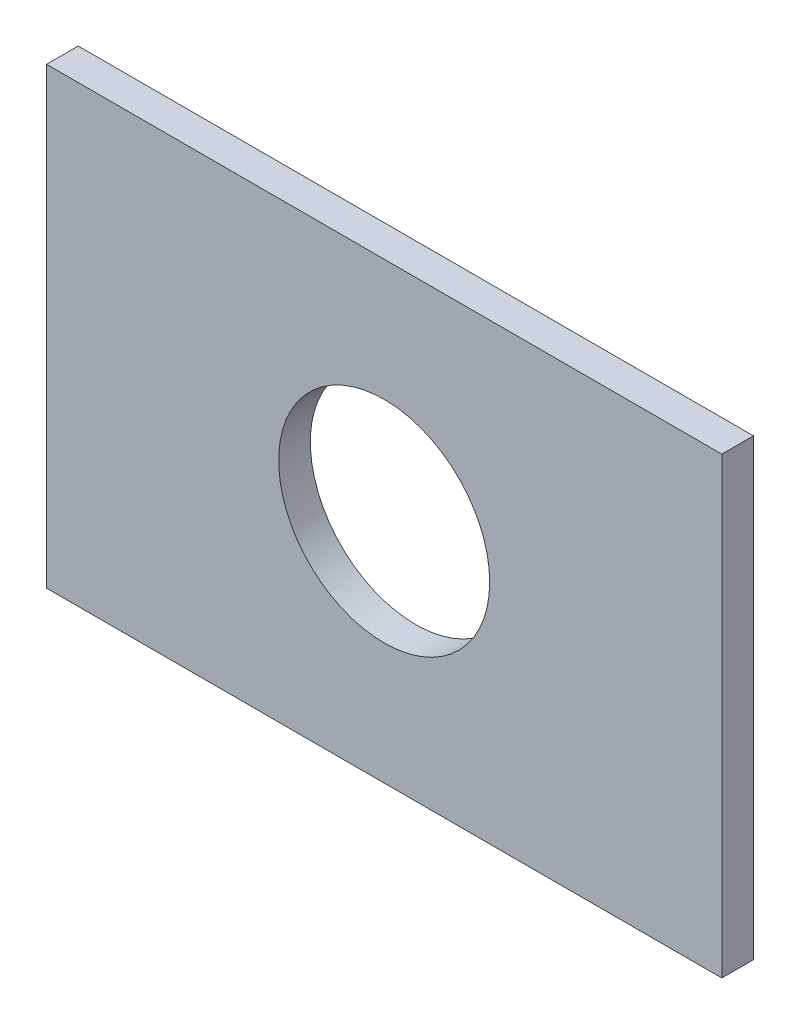
ISO-10303-21;
HEADER;
FILE_DESCRIPTION(('STEP AP214'),'2;1');
FILE_NAME('part.step','',(''),(''),'','','');
FILE_SCHEMA(('AUTOMOTIVE_DESIGN { 1 0 10303 214 1 1 1 1 }'));
ENDSEC;
DATA;
#1=APPLICATION_CONTEXT('core data for automotive mechanical design processes');
#2=APPLICATION_PROTOCOL_DEFINITION('international standard','automotive_design',2000,#1);
#3=PRODUCT_CONTEXT('',#1,'mechanical');
#4=PRODUCT('Part','Part','',(#3));
#5=PRODUCT_RELATED_PRODUCT_CATEGORY('part','',(#4));
#6=PRODUCT_DEFINITION_FORMATION('','',#4);
#7=PRODUCT_DEFINITION_CONTEXT('part definition',#1,'design');
#8=PRODUCT_DEFINITION('design','',#6,#7);
#9=PRODUCT_DEFINITION_SHAPE('','',#8);
#10=(LENGTH_UNIT() NAMED_UNIT(*) SI_UNIT(.MILLI.,.METRE.));
#11=(NAMED_UNIT(*) PLANE_ANGLE_UNIT() SI_UNIT($,.RADIAN.));
#12=(NAMED_UNIT(*) SI_UNIT($,.STERADIAN.) SOLID_ANGLE_UNIT());
#13=UNCERTAINTY_MEASURE_WITH_UNIT(LENGTH_MEASURE(1.E-05),#10,'distance_accuracy_value','');
#14=(GEOMETRIC_REPRESENTATION_CONTEXT(3) GLOBAL_UNCERTAINTY_ASSIGNED_CONTEXT((#13)) GLOBAL_UNIT_ASSIGNED_CONTEXT((#10,
#11,#12)) REPRESENTATION_CONTEXT('',''));
#15=CARTESIAN_POINT('',(0.,0.,0.));
#16=DIRECTION('',(0.,0.,1.));
#17=DIRECTION('',(1.,0.,0.));
#18=AXIS2_PLACEMENT_3D('',#15,#16,#17);
#19=CARTESIAN_POINT('',(-32.,21.5,3.));
#20=DIRECTION('',(0.,0.,-1.));
#21=DIRECTION('',(-1.,0.,0.));
#22=AXIS2_PLACEMENT_3D('',#19,#20,#21);
#23=PLANE('',#22);
#24=DIRECTION('',(0.,-1.,0.));
#25=VECTOR('',#24,1.);
#26=CARTESIAN_POINT('',(-32.,-21.5,3.));
#27=LINE('',#26,#25);
#28=CARTESIAN_POINT('',(-32.,21.5,3.));
#29=VERTEX_POINT('',#28);
#30=CARTESIAN_POINT('',(-32.,-21.5,3.));
#31=VERTEX_POINT('',#30);
#32=EDGE_CURVE('E101',#29,#31,#27,.T.);
#33=ORIENTED_EDGE('',*,*,#32,.T.);
#34=DIRECTION('',(1.,0.,0.));
#35=VECTOR('',#34,1.);
#36=CARTESIAN_POINT('',(-32.,-21.5,3.));
#37=LINE('',#36,#35);
#38=CARTESIAN_POINT('',(32.,-21.5,3.));
#39=VERTEX_POINT('',#38);
#40=EDGE_CURVE('E86',#31,#39,#37,.T.);
#41=ORIENTED_EDGE('',*,*,#40,.T.);
#42=DIRECTION('',(0.,1.,0.));
#43=VECTOR('',#42,1.);
#44=CARTESIAN_POINT('',(32.,-21.5,3.));
#45=LINE('',#44,#43);
#46=CARTESIAN_POINT('',(32.,21.5,3.));
#47=VERTEX_POINT('',#46);
#48=EDGE_CURVE('E52',#39,#47,#45,.T.);
#49=ORIENTED_EDGE('',*,*,#48,.T.);
#50=DIRECTION('',(-1.,0.,0.));
#51=VECTOR('',#50,1.);
#52=CARTESIAN_POINT('',(-32.,21.5,3.));
#53=LINE('',#52,#51);
#54=EDGE_CURVE('E47',#47,#29,#53,.T.);
#55=ORIENTED_EDGE('',*,*,#54,.T.);
#56=EDGE_LOOP('',(#33,#41,#49,#55));
#57=FACE_BOUND('',#56,.T.);
#58=CARTESIAN_POINT('',(0.,0.,3.));
#59=DIRECTION('',(0.,0.,1.));
#60=DIRECTION('',(1.,0.,0.));
#61=AXIS2_PLACEMENT_3D('',#58,#59,#60);
#62=CIRCLE('',#61,10.);
#63=CARTESIAN_POINT('',(10.,0.,3.));
#64=VERTEX_POINT('',#63);
#65=EDGE_CURVE('E91',#64,#64,#62,.T.);
#66=ORIENTED_EDGE('',*,*,#65,.F.);
#67=EDGE_LOOP('',(#66));
#68=FACE_BOUND('',#67,.T.);
#69=ADVANCED_FACE('F32',(#57,#68),#23,.F.);
#70=CARTESIAN_POINT('',(-32.,21.5,0.));
#71=DIRECTION('',(0.,0.,-1.));
#72=DIRECTION('',(-1.,0.,0.));
#73=AXIS2_PLACEMENT_3D('',#70,#71,#72);
#74=PLANE('',#73);
#75=DIRECTION('',(0.,-1.,0.));
#76=VECTOR('',#75,1.);
#77=CARTESIAN_POINT('',(-32.,-21.5,0.));
#78=LINE('',#77,#76);
#79=CARTESIAN_POINT('',(-32.,21.5,0.));
#80=VERTEX_POINT('',#79);
#81=CARTESIAN_POINT('',(-32.,-21.5,0.));
#82=VERTEX_POINT('',#81);
#83=EDGE_CURVE('E78',#80,#82,#78,.T.);
#84=ORIENTED_EDGE('',*,*,#83,.F.);
#85=DIRECTION('',(-1.,0.,0.));
#86=VECTOR('',#85,1.);
#87=CARTESIAN_POINT('',(-32.,21.5,0.));
#88=LINE('',#87,#86);
#89=CARTESIAN_POINT('',(32.,21.5,0.));
#90=VERTEX_POINT('',#89);
#91=EDGE_CURVE('E99',#90,#80,#88,.T.);
#92=ORIENTED_EDGE('',*,*,#91,.F.);
#93=DIRECTION('',(0.,1.,0.));
#94=VECTOR('',#93,1.);
#95=CARTESIAN_POINT('',(32.,-21.5,0.));
#96=LINE('',#95,#94);
#97=CARTESIAN_POINT('',(32.,-21.5,0.));
#98=VERTEX_POINT('',#97);
#99=EDGE_CURVE('E79',#98,#90,#96,.T.);
#100=ORIENTED_EDGE('',*,*,#99,.F.);
#101=DIRECTION('',(1.,0.,0.));
#102=VECTOR('',#101,1.);
#103=CARTESIAN_POINT('',(-32.,-21.5,0.));
#104=LINE('',#103,#102);
#105=EDGE_CURVE('E73',#82,#98,#104,.T.);
#106=ORIENTED_EDGE('',*,*,#105,.F.);
#107=EDGE_LOOP('',(#84,#92,#100,#106));
#108=FACE_BOUND('',#107,.T.);
#109=CARTESIAN_POINT('',(0.,0.,0.));
#110=DIRECTION('',(0.,0.,1.));
#111=DIRECTION('',(1.,0.,0.));
#112=AXIS2_PLACEMENT_3D('',#109,#110,#111);
#113=CIRCLE('',#112,10.);
#114=CARTESIAN_POINT('',(10.,0.,0.));
#115=VERTEX_POINT('',#114);
#116=EDGE_CURVE('E94',#115,#115,#113,.T.);
#117=ORIENTED_EDGE('',*,*,#116,.T.);
#118=EDGE_LOOP('',(#117));
#119=FACE_BOUND('',#118,.T.);
#120=ADVANCED_FACE('F74',(#108,#119),#74,.T.);
#121=CARTESIAN_POINT('',(-32.,-21.5,3.));
#122=DIRECTION('',(1.,0.,0.));
#123=DIRECTION('',(0.,0.,-1.));
#124=AXIS2_PLACEMENT_3D('',#121,#122,#123);
#125=PLANE('',#124);
#126=ORIENTED_EDGE('',*,*,#83,.T.);
#127=DIRECTION('',(0.,0.,-1.));
#128=VECTOR('',#127,1.);
#129=CARTESIAN_POINT('',(-32.,-21.5,3.));
#130=LINE('',#129,#128);
#131=EDGE_CURVE('E11',#31,#82,#130,.T.);
#132=ORIENTED_EDGE('',*,*,#131,.F.);
#133=ORIENTED_EDGE('',*,*,#32,.F.);
#134=DIRECTION('',(0.,0.,-1.));
#135=VECTOR('',#134,1.);
#136=CARTESIAN_POINT('',(-32.,21.5,3.));
#137=LINE('',#136,#135);
#138=EDGE_CURVE('E90',#29,#80,#137,.T.);
#139=ORIENTED_EDGE('',*,*,#138,.T.);
#140=EDGE_LOOP('',(#126,#132,#133,#139));
#141=FACE_BOUND('',#140,.T.);
#142=ADVANCED_FACE('F34',(#141),#125,.F.);
#143=CARTESIAN_POINT('',(-32.,-21.5,3.));
#144=DIRECTION('',(0.,1.,0.));
#145=DIRECTION('',(0.,0.,1.));
#146=AXIS2_PLACEMENT_3D('',#143,#144,#145);
#147=PLANE('',#146);
#148=ORIENTED_EDGE('',*,*,#105,.T.);
#149=DIRECTION('',(0.,0.,-1.));
#150=VECTOR('',#149,1.);
#151=CARTESIAN_POINT('',(32.,-21.5,3.));
#152=LINE('',#151,#150);
#153=EDGE_CURVE('E40',#39,#98,#152,.T.);
#154=ORIENTED_EDGE('',*,*,#153,.F.);
#155=ORIENTED_EDGE('',*,*,#40,.F.);
#156=ORIENTED_EDGE('',*,*,#131,.T.);
#157=EDGE_LOOP('',(#148,#154,#155,#156));
#158=FACE_BOUND('',#157,.T.);
#159=ADVANCED_FACE('F85',(#158),#147,.F.);
#160=CARTESIAN_POINT('',(32.,-21.5,3.));
#161=DIRECTION('',(-1.,0.,0.));
#162=DIRECTION('',(0.,0.,1.));
#163=AXIS2_PLACEMENT_3D('',#160,#161,#162);
#164=PLANE('',#163);
#165=ORIENTED_EDGE('',*,*,#99,.T.);
#166=DIRECTION('',(0.,0.,-1.));
#167=VECTOR('',#166,1.);
#168=CARTESIAN_POINT('',(32.,21.5,3.));
#169=LINE('',#168,#167);
#170=EDGE_CURVE('E107',#47,#90,#169,.T.);
#171=ORIENTED_EDGE('',*,*,#170,.F.);
#172=ORIENTED_EDGE('',*,*,#48,.F.);
#173=ORIENTED_EDGE('',*,*,#153,.T.);
#174=EDGE_LOOP('',(#165,#171,#172,#173));
#175=FACE_BOUND('',#174,.T.);
#176=ADVANCED_FACE('F110',(#175),#164,.F.);
#177=CARTESIAN_POINT('',(-32.,21.5,3.));
#178=DIRECTION('',(0.,-1.,0.));
#179=DIRECTION('',(0.,0.,-1.));
#180=AXIS2_PLACEMENT_3D('',#177,#178,#179);
#181=PLANE('',#180);
#182=ORIENTED_EDGE('',*,*,#91,.T.);
#183=ORIENTED_EDGE('',*,*,#138,.F.);
#184=ORIENTED_EDGE('',*,*,#54,.F.);
#185=ORIENTED_EDGE('',*,*,#170,.T.);
#186=EDGE_LOOP('',(#182,#183,#184,#185));
#187=FACE_BOUND('',#186,.T.);
#188=ADVANCED_FACE('F112',(#187),#181,.F.);
#189=CARTESIAN_POINT('',(0.,0.,3.));
#190=DIRECTION('',(0.,0.,-1.));
#191=DIRECTION('',(-1.,0.,0.));
#192=AXIS2_PLACEMENT_3D('',#189,#190,#191);
#193=CYLINDRICAL_SURFACE('',#192,10.);
#194=ORIENTED_EDGE('',*,*,#65,.T.);
#195=EDGE_LOOP('',(#194));
#196=FACE_BOUND('',#195,.T.);
#197=ORIENTED_EDGE('',*,*,#116,.F.);
#198=EDGE_LOOP('',(#197));
#199=FACE_BOUND('',#198,.T.);
#200=ADVANCED_FACE('F118',(#196,#199),#193,.F.);
#201=CLOSED_SHELL('',(#69,#120,#142,#159,#176,#188,#200));
#202=MANIFOLD_SOLID_BREP('B2',#201);
#203=ADVANCED_BREP_SHAPE_REPRESENTATION('',(#18,#202),#14);
#204=SHAPE_DEFINITION_REPRESENTATION(#9,#203);
ENDSEC;
END-ISO-10303-21;
